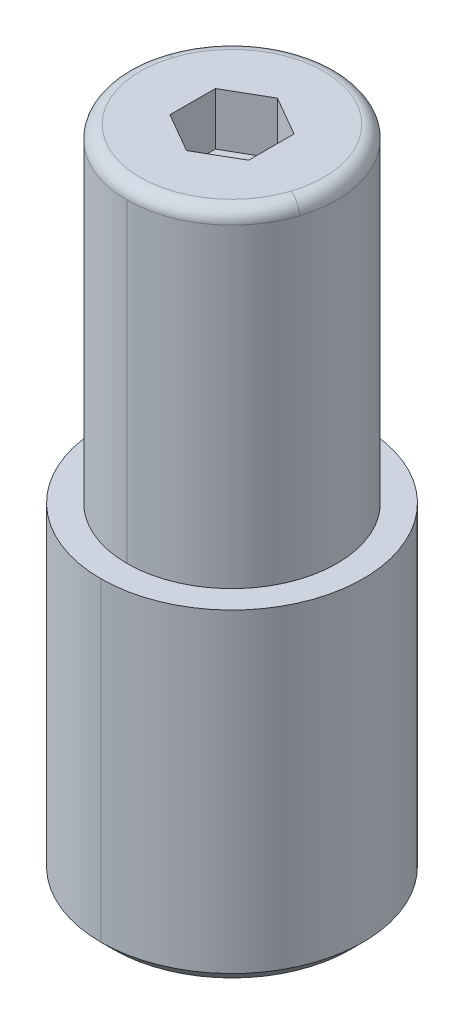
ISO-10303-21;
HEADER;
FILE_DESCRIPTION(('STEP AP214'),'2;1');
FILE_NAME('part.step','',(''),(''),'','','');
FILE_SCHEMA(('AUTOMOTIVE_DESIGN { 1 0 10303 214 1 1 1 1 }'));
ENDSEC;
DATA;
#1=APPLICATION_CONTEXT('core data for automotive mechanical design processes');
#2=APPLICATION_PROTOCOL_DEFINITION('international standard','automotive_design',2000,#1);
#3=PRODUCT_CONTEXT('',#1,'mechanical');
#4=PRODUCT('Part','Part','',(#3));
#5=PRODUCT_RELATED_PRODUCT_CATEGORY('part','',(#4));
#6=PRODUCT_DEFINITION_FORMATION('','',#4);
#7=PRODUCT_DEFINITION_CONTEXT('part definition',#1,'design');
#8=PRODUCT_DEFINITION('design','',#6,#7);
#9=PRODUCT_DEFINITION_SHAPE('','',#8);
#10=(LENGTH_UNIT() NAMED_UNIT(*) SI_UNIT(.MILLI.,.METRE.));
#11=(NAMED_UNIT(*) PLANE_ANGLE_UNIT() SI_UNIT($,.RADIAN.));
#12=(NAMED_UNIT(*) SI_UNIT($,.STERADIAN.) SOLID_ANGLE_UNIT());
#13=UNCERTAINTY_MEASURE_WITH_UNIT(LENGTH_MEASURE(1.E-05),#10,'distance_accuracy_value','');
#14=(GEOMETRIC_REPRESENTATION_CONTEXT(3) GLOBAL_UNCERTAINTY_ASSIGNED_CONTEXT((#13)) GLOBAL_UNIT_ASSIGNED_CONTEXT((#10,
#11,#12)) REPRESENTATION_CONTEXT('',''));
#15=CARTESIAN_POINT('',(0.,0.,0.));
#16=DIRECTION('',(0.,0.,1.));
#17=DIRECTION('',(1.,0.,0.));
#18=AXIS2_PLACEMENT_3D('',#15,#16,#17);
#19=CARTESIAN_POINT('',(0.,25.,0.));
#20=DIRECTION('',(0.,-1.,0.));
#21=DIRECTION('',(0.,0.,-1.));
#22=AXIS2_PLACEMENT_3D('',#19,#20,#21);
#23=PLANE('',#22);
#24=CARTESIAN_POINT('',(3.32869780703263,25.,1.08155948031218));
#25=CARTESIAN_POINT('',(3.31100196890181,25.,1.13602560121398));
#26=CARTESIAN_POINT('',(3.29196710397147,25.,1.19005653724678));
#27=CARTESIAN_POINT('',(3.25127016882578,25.,1.29711977171583));
#28=CARTESIAN_POINT('',(3.22960809861043,25.,1.35015207015209));
#29=CARTESIAN_POINT('',(3.18370760120874,25.,1.45508976156955));
#30=CARTESIAN_POINT('',(3.1594691740224,25.,1.50699515455075));
#31=CARTESIAN_POINT('',(3.10847471355772,25.,1.60955412664714));
#32=CARTESIAN_POINT('',(3.08171868027937,25.,1.66020770576233));
#33=CARTESIAN_POINT('',(3.02575336922947,25.,1.76014098471593));
#34=CARTESIAN_POINT('',(2.9965440914579,25.,1.80942068455435));
#35=CARTESIAN_POINT('',(2.93574268486102,25.,1.90648749562176));
#36=CARTESIAN_POINT('',(2.90415055603569,25.,1.95427460685077));
#37=CARTESIAN_POINT('',(2.8386595486422,25.,2.04824111474203));
#38=CARTESIAN_POINT('',(2.80476067007404,25.,2.09442051140429));
#39=CARTESIAN_POINT('',(2.73473783040991,25.,2.1850603406529));
#40=CARTESIAN_POINT('',(2.69861386931396,25.,2.22952077323924));
#41=CARTESIAN_POINT('',(2.62422788988561,25.,2.31661556507148));
#42=CARTESIAN_POINT('',(2.58596587155323,25.,2.35924992431738));
#43=CARTESIAN_POINT('',(2.50739595433818,25.,2.44258985961338));
#44=CARTESIAN_POINT('',(2.46708805545552,25.,2.48329543566349));
#45=CARTESIAN_POINT('',(2.38452348236335,25.,2.56267974125632));
#46=CARTESIAN_POINT('',(2.34226680815383,25.,2.60135847079904));
#47=CARTESIAN_POINT('',(2.2559064844469,25.,2.6765959029334));
#48=CARTESIAN_POINT('',(2.21180283494948,25.,2.71315460552503));
#49=CARTESIAN_POINT('',(2.12185481021884,25.,2.78406391063952));
#50=CARTESIAN_POINT('',(2.07601043498562,25.,2.81841451316238));
#51=CARTESIAN_POINT('',(1.98269140189949,25.,2.88482486452935));
#52=CARTESIAN_POINT('',(1.93521674404659,25.,2.91688461337347));
#53=CARTESIAN_POINT('',(1.83875151632996,25.,2.97863602263982));
#54=CARTESIAN_POINT('',(1.78976094646625,25.,3.00832768306205));
#55=CARTESIAN_POINT('',(1.69038191730192,25.,3.06527138567402));
#56=CARTESIAN_POINT('',(1.63999345800131,25.,3.09252342786375));
#57=CARTESIAN_POINT('',(1.53794004017514,25.,3.14452224145407));
#58=CARTESIAN_POINT('',(1.48627508164959,25.,3.16926901285466));
#59=CARTESIAN_POINT('',(1.38179313078394,25.,3.21619766772684));
#60=CARTESIAN_POINT('',(1.32897613844385,25.,3.23837955119842));
#61=CARTESIAN_POINT('',(1.2223173607099,25.,3.28012499211241));
#62=CARTESIAN_POINT('',(1.16847557531604,25.,3.2996885495548));
#63=CARTESIAN_POINT('',(1.05989692105155,25.,3.33615020808696));
#64=CARTESIAN_POINT('',(1.00516005218092,25.,3.35304830917672));
#65=CARTESIAN_POINT('',(0.894923096874379,25.,3.38413834599799));
#66=CARTESIAN_POINT('',(0.839423010438471,25.,3.39833028172949));
#67=CARTESIAN_POINT('',(0.727793324570835,25.,3.42397379821799));
#68=CARTESIAN_POINT('',(0.671663725139107,25.,3.43542537897499));
#69=CARTESIAN_POINT('',(0.558910234401233,25.,3.45556059765341));
#70=CARTESIAN_POINT('',(0.502286343095088,25.,3.46424423557482));
#71=CARTESIAN_POINT('',(0.388680680522205,25.,3.47882264893771));
#72=CARTESIAN_POINT('',(0.331698909255467,25.,3.48471742437919));
#73=CARTESIAN_POINT('',(0.217514760839391,25.,3.49370391175185));
#74=CARTESIAN_POINT('',(0.160312383690054,25.,3.49679562368304));
#75=CARTESIAN_POINT('',(0.0458248290456724,25.,3.50016853583026));
#76=CARTESIAN_POINT('',(-0.0114603484493725,25.,3.5004497360463));
#77=CARTESIAN_POINT('',(-0.125975498774997,25.,3.4982009473273));
#78=CARTESIAN_POINT('',(-0.183205471605577,25.,3.49567095839225));
#79=CARTESIAN_POINT('',(-0.297472340584969,25.,3.48780588633601));
#80=CARTESIAN_POINT('',(-0.35450923673378,25.,3.48247080321482));
#81=CARTESIAN_POINT('',(-0.468252545470971,25.,3.46900839546882));
#82=CARTESIAN_POINT('',(-0.524958958059351,25.,3.46088107084402));
#83=CARTESIAN_POINT('',(-0.637904688960856,25.,3.4418537595277));
#84=CARTESIAN_POINT('',(-0.694144007273981,25.,3.43095377283618));
#85=CARTESIAN_POINT('',(-0.80602006418118,25.,3.40640739640909));
#86=CARTESIAN_POINT('',(-0.861656802775253,25.,3.39276100667352));
#87=CARTESIAN_POINT('',(-0.972193666467872,25.,3.36275469950649));
#88=CARTESIAN_POINT('',(-1.02709379156642,25.,3.34639478207502));
#89=CARTESIAN_POINT('',(-1.13602516905794,25.,3.31100083199025));
#90=CARTESIAN_POINT('',(-1.19005642145091,25.,3.29196679933694));
#91=CARTESIAN_POINT('',(-1.29711988751169,25.,3.25127047346032));
#92=CARTESIAN_POINT('',(-1.35015210117949,25.,3.22960818023701));
#93=CARTESIAN_POINT('',(-1.45508973054214,25.,3.18370751958216));
#94=CARTESIAN_POINT('',(-1.50699514623698,25.,3.15946915215063));
#95=CARTESIAN_POINT('',(-1.60955413496091,25.,3.1084747354295));
#96=CARTESIAN_POINT('',(-1.66020770798999,25.,3.0817186861399));
#97=CARTESIAN_POINT('',(-1.76014098248826,25.,3.02575336336894));
#98=CARTESIAN_POINT('',(-1.80942068395744,25.,2.99654408988758));
#99=CARTESIAN_POINT('',(-1.90648749621866,25.,2.93574268643134));
#100=CARTESIAN_POINT('',(-1.9542746070107,25.,2.90415055645646));
#101=CARTESIAN_POINT('',(-2.04824111458209,25.,2.83865954822144));
#102=CARTESIAN_POINT('',(-2.09442051136143,25.,2.8047606699613));
#103=CARTESIAN_POINT('',(-2.18506034069575,25.,2.73473783052266));
#104=CARTESIAN_POINT('',(-2.22952077325072,25.,2.69861386934417));
#105=CARTESIAN_POINT('',(-2.31661556506,25.,2.62422788985541));
#106=CARTESIAN_POINT('',(-2.3592499243143,25.,2.58596587154514));
#107=CARTESIAN_POINT('',(-2.44258985961645,25.,2.50739595434628));
#108=CARTESIAN_POINT('',(-2.48329543566431,25.,2.46708805545769));
#109=CARTESIAN_POINT('',(-2.56267974125549,25.,2.38452348236118));
#110=CARTESIAN_POINT('',(-2.60135847079882,25.,2.34226680815326));
#111=CARTESIAN_POINT('',(-2.67659590293361,25.,2.25590648444749));
#112=CARTESIAN_POINT('',(-2.71315460552508,25.,2.21180283494964));
#113=CARTESIAN_POINT('',(-2.78406391063945,25.,2.12185481021869));
#114=CARTESIAN_POINT('',(-2.81841451316236,25.,2.07601043498558));
#115=CARTESIAN_POINT('',(-2.88482486452936,25.,1.98269140189954));
#116=CARTESIAN_POINT('',(-2.91688461337347,25.,1.9352167440466));
#117=CARTESIAN_POINT('',(-2.97863602263981,25.,1.83875151632996));
#118=CARTESIAN_POINT('',(-3.00832768306204,25.,1.78976094646625));
#119=CARTESIAN_POINT('',(-3.06527138567401,25.,1.69038191730193));
#120=CARTESIAN_POINT('',(-3.09252342786374,25.,1.63999345800131));
#121=CARTESIAN_POINT('',(-3.14452224145406,25.,1.53794004017515));
#122=CARTESIAN_POINT('',(-3.16926901285465,25.,1.48627508164959));
#123=CARTESIAN_POINT('',(-3.21619766772684,25.,1.38179313078394));
#124=CARTESIAN_POINT('',(-3.23837955119843,25.,1.32897613844385));
#125=CARTESIAN_POINT('',(-3.28012499211239,25.,1.2223173607099));
#126=CARTESIAN_POINT('',(-3.29968854955476,25.,1.16847557531605));
#127=CARTESIAN_POINT('',(-3.336150208087,25.,1.05989692105154));
#128=CARTESIAN_POINT('',(-3.35304830917688,25.,1.00516005218088));
#129=CARTESIAN_POINT('',(-3.38413834599782,25.,0.894923096874429));
#130=CARTESIAN_POINT('',(-3.39833028172889,25.,0.839423010438641));
#131=CARTESIAN_POINT('',(-3.42397379821859,25.,0.72779332457068));
#132=CARTESIAN_POINT('',(-3.43542537897723,25.,0.671663725138506));
#133=CARTESIAN_POINT('',(-3.45556059765117,25.,0.558910234401848));
#134=CARTESIAN_POINT('',(-3.46424423556646,25.,0.502286343097365));
#135=CARTESIAN_POINT('',(-3.47882264894607,25.,0.388680680519945));
#136=CARTESIAN_POINT('',(-3.48471742441038,25.,0.331698909247007));
#137=CARTESIAN_POINT('',(-3.49370391172066,25.,0.217514760847865));
#138=CARTESIAN_POINT('',(-3.49679562356663,25.,0.16031238372166));
#139=CARTESIAN_POINT('',(-3.50016853594666,25.,0.0458248290140814));
#140=CARTESIAN_POINT('',(-3.50044973648072,25.,-0.0114603485672923));
#141=CARTESIAN_POINT('',(-3.49820094689288,25.,-0.125975498657063));
#142=CARTESIAN_POINT('',(-3.49567095677098,25.,-0.183205471165461));
#143=CARTESIAN_POINT('',(-3.48780588795728,25.,-0.29747234102507));
#144=CARTESIAN_POINT('',(-3.48247080926547,25.,-0.354509238376281));
#145=CARTESIAN_POINT('',(-3.46900838941817,25.,-0.468252543828454));
#146=CARTESIAN_POINT('',(-3.46088104826267,25.,-0.524958951929415));
#147=CARTESIAN_POINT('',(-3.44185378210905,25.,-0.637904695090773));
#148=CARTESIAN_POINT('',(-3.43095385711093,25.,-0.69414403015117));
#149=CARTESIAN_POINT('',(-3.40640731213435,25.,-0.806020041303973));
#150=CARTESIAN_POINT('',(-3.39276069215591,25.,-0.861656717396378));
#151=CARTESIAN_POINT('',(-3.36275501402411,25.,-0.972193751846732));
#152=CARTESIAN_POINT('',(-3.34639595587075,25.,-1.02709411020468));
#153=CARTESIAN_POINT('',(-3.32869780703264,25.,-1.08155948031217));
#154=B_SPLINE_CURVE_WITH_KNOTS('',3,(#24,#25,#26,#27,#28,#29,#30,#31,#32,#33,#34,#35,#36,#37,
#38,#39,#40,#41,#42,#43,#44,#45,#46,#47,#48,#49,#50,#51,#52,#53,#54,#55,#56,#57,#58,#59,#60,#61,
#62,#63,#64,#65,#66,#67,#68,#69,#70,#71,#72,#73,#74,#75,#76,#77,#78,#79,#80,#81,#82,#83,#84,#85,
#86,#87,#88,#89,#90,#91,#92,#93,#94,#95,#96,#97,#98,#99,#100,#101,#102,#103,#104,#105,#106,#107,
#108,#109,#110,#111,#112,#113,#114,#115,#116,#117,#118,#119,#120,#121,#122,#123,#124,#125,#126,
#127,#128,#129,#130,#131,#132,#133,#134,#135,#136,#137,#138,#139,#140,#141,#142,#143,#144,#145,
#146,#147,#148,#149,#150,#151,#152,#153),.UNSPECIFIED.,.F.,.F.,(4,2,2,2,2,2,2,2,2,2,2,2,2,2,2,2,
2,2,2,2,2,2,2,2,2,2,2,2,2,2,2,2,2,2,2,2,2,2,2,2,2,2,2,2,2,2,2,2,2,2,2,2,2,2,2,2,2,2,2,2,2,2,2,2,
4),(0.,0.171788599660365,0.34357719932073,0.515365798981095,0.68715439864146,0.858942998301824,
1.03073159796219,1.20252019762255,1.37430879728292,1.54609739694329,1.71788599660365,
1.88967459626401,2.06146319592438,2.23325179558474,2.40504039524511,2.57682899490547,
2.74861759456584,2.9204061942262,3.09219479388657,3.26398339354694,3.4357719932073,
3.60756059286766,3.77934919252803,3.95113779218839,4.12292639184876,4.29471499150913,
4.46650359116949,4.63829219082985,4.81008079049022,4.98186939015059,5.15365798981095,
5.32544658947131,5.49723518913168,5.66902378879204,5.84081238845241,6.01260098811277,
6.18438958777314,6.3561781874335,6.52796678709387,6.69975538675423,6.8715439864146,
7.04333258607496,7.21512118573533,7.38690978539569,7.55869838505606,7.73048698471642,
7.90227558437678,8.07406418403715,8.24585278369752,8.41764138335788,8.58942998301825,
8.76121858267861,8.93300718233898,9.10479578199934,9.2765843816597,9.44837298132007,
9.62016158098043,9.7919501806408,9.96373878030116,10.1355273799615,10.3073159796219,
10.4791045792823,10.6508931789426,10.822681778603,10.9944703782633),.UNSPECIFIED.);
#155=CARTESIAN_POINT('',(3.32869780703263,25.,1.08155948031218));
#156=VERTEX_POINT('',#155);
#157=CARTESIAN_POINT('',(-3.32869780703263,25.,-1.08155948031218));
#158=VERTEX_POINT('',#157);
#159=EDGE_CURVE('E10',#156,#158,#154,.T.);
#160=ORIENTED_EDGE('',*,*,#159,.F.);
#161=CARTESIAN_POINT('',(-3.32869780703263,25.,-1.08155948031218));
#162=CARTESIAN_POINT('',(-3.31100196890181,25.,-1.13602560121398));
#163=CARTESIAN_POINT('',(-3.29196710397147,25.,-1.19005653724678));
#164=CARTESIAN_POINT('',(-3.25127016882578,25.,-1.29711977171583));
#165=CARTESIAN_POINT('',(-3.22960809861043,25.,-1.35015207015209));
#166=CARTESIAN_POINT('',(-3.18370760120874,25.,-1.45508976156955));
#167=CARTESIAN_POINT('',(-3.1594691740224,25.,-1.50699515455075));
#168=CARTESIAN_POINT('',(-3.10847471355772,25.,-1.60955412664714));
#169=CARTESIAN_POINT('',(-3.08171868027937,25.,-1.66020770576233));
#170=CARTESIAN_POINT('',(-3.02575336922947,25.,-1.76014098471593));
#171=CARTESIAN_POINT('',(-2.9965440914579,25.,-1.80942068455435));
#172=CARTESIAN_POINT('',(-2.93574268486102,25.,-1.90648749562176));
#173=CARTESIAN_POINT('',(-2.90415055603569,25.,-1.95427460685077));
#174=CARTESIAN_POINT('',(-2.8386595486422,25.,-2.04824111474203));
#175=CARTESIAN_POINT('',(-2.80476067007404,25.,-2.09442051140429));
#176=CARTESIAN_POINT('',(-2.73473783040991,25.,-2.1850603406529));
#177=CARTESIAN_POINT('',(-2.69861386931396,25.,-2.22952077323924));
#178=CARTESIAN_POINT('',(-2.62422788988562,25.,-2.31661556507148));
#179=CARTESIAN_POINT('',(-2.58596587155323,25.,-2.35924992431738));
#180=CARTESIAN_POINT('',(-2.50739595433818,25.,-2.44258985961338));
#181=CARTESIAN_POINT('',(-2.46708805545552,25.,-2.48329543566349));
#182=CARTESIAN_POINT('',(-2.38452348236335,25.,-2.56267974125632));
#183=CARTESIAN_POINT('',(-2.34226680815383,25.,-2.60135847079904));
#184=CARTESIAN_POINT('',(-2.2559064844469,25.,-2.6765959029334));
#185=CARTESIAN_POINT('',(-2.21180283494948,25.,-2.71315460552502));
#186=CARTESIAN_POINT('',(-2.12185481021884,25.,-2.78406391063951));
#187=CARTESIAN_POINT('',(-2.07601043498562,25.,-2.81841451316238));
#188=CARTESIAN_POINT('',(-1.98269140189949,25.,-2.88482486452935));
#189=CARTESIAN_POINT('',(-1.93521674404659,25.,-2.91688461337347));
#190=CARTESIAN_POINT('',(-1.83875151632996,25.,-2.97863602263982));
#191=CARTESIAN_POINT('',(-1.78976094646625,25.,-3.00832768306205));
#192=CARTESIAN_POINT('',(-1.69038191730192,25.,-3.06527138567401));
#193=CARTESIAN_POINT('',(-1.63999345800131,25.,-3.09252342786374));
#194=CARTESIAN_POINT('',(-1.53794004017514,25.,-3.14452224145407));
#195=CARTESIAN_POINT('',(-1.48627508164959,25.,-3.16926901285466));
#196=CARTESIAN_POINT('',(-1.38179313078394,25.,-3.21619766772683));
#197=CARTESIAN_POINT('',(-1.32897613844385,25.,-3.23837955119842));
#198=CARTESIAN_POINT('',(-1.2223173607099,25.,-3.28012499211241));
#199=CARTESIAN_POINT('',(-1.16847557531604,25.,-3.2996885495548));
#200=CARTESIAN_POINT('',(-1.05989692105155,25.,-3.33615020808696));
#201=CARTESIAN_POINT('',(-1.00516005218092,25.,-3.35304830917672));
#202=CARTESIAN_POINT('',(-0.894923096874382,25.,-3.38413834599799));
#203=CARTESIAN_POINT('',(-0.839423010438474,25.,-3.39833028172949));
#204=CARTESIAN_POINT('',(-0.727793324570838,25.,-3.42397379821799));
#205=CARTESIAN_POINT('',(-0.67166372513911,25.,-3.43542537897499));
#206=CARTESIAN_POINT('',(-0.558910234401237,25.,-3.45556059765341));
#207=CARTESIAN_POINT('',(-0.502286343095092,25.,-3.46424423557482));
#208=CARTESIAN_POINT('',(-0.388680680522208,25.,-3.47882264893771));
#209=CARTESIAN_POINT('',(-0.33169890925547,25.,-3.48471742437919));
#210=CARTESIAN_POINT('',(-0.217514760839395,25.,-3.49370391175185));
#211=CARTESIAN_POINT('',(-0.160312383690058,25.,-3.49679562368304));
#212=CARTESIAN_POINT('',(-0.0458248290456753,25.,-3.50016853583026));
#213=CARTESIAN_POINT('',(0.01146034844937,25.,-3.5004497360463));
#214=CARTESIAN_POINT('',(0.125975498774995,25.,-3.4982009473273));
#215=CARTESIAN_POINT('',(0.183205471605575,25.,-3.49567095839225));
#216=CARTESIAN_POINT('',(0.297472340584966,25.,-3.48780588633601));
#217=CARTESIAN_POINT('',(0.354509236733777,25.,-3.48247080321482));
#218=CARTESIAN_POINT('',(0.468252545470967,25.,-3.46900839546882));
#219=CARTESIAN_POINT('',(0.524958958059345,25.,-3.46088107084402));
#220=CARTESIAN_POINT('',(0.63790468896085,25.,-3.4418537595277));
#221=CARTESIAN_POINT('',(0.694144007273977,25.,-3.43095377283618));
#222=CARTESIAN_POINT('',(0.806020064181177,25.,-3.40640739640909));
#223=CARTESIAN_POINT('',(0.86165680277525,25.,-3.39276100667352));
#224=CARTESIAN_POINT('',(0.97219366646787,25.,-3.36275469950649));
#225=CARTESIAN_POINT('',(1.02709379156642,25.,-3.34639478207502));
#226=CARTESIAN_POINT('',(1.13602516905793,25.,-3.31100083199025));
#227=CARTESIAN_POINT('',(1.19005642145091,25.,-3.29196679933694));
#228=CARTESIAN_POINT('',(1.29711988751168,25.,-3.25127047346032));
#229=CARTESIAN_POINT('',(1.35015210117949,25.,-3.22960818023701));
#230=CARTESIAN_POINT('',(1.45508973054214,25.,-3.18370751958217));
#231=CARTESIAN_POINT('',(1.50699514623698,25.,-3.15946915215063));
#232=CARTESIAN_POINT('',(1.6095541349609,25.,-3.1084747354295));
#233=CARTESIAN_POINT('',(1.66020770798999,25.,-3.0817186861399));
#234=CARTESIAN_POINT('',(1.76014098248826,25.,-3.02575336336895));
#235=CARTESIAN_POINT('',(1.80942068395744,25.,-2.99654408988759));
#236=CARTESIAN_POINT('',(1.90648749621866,25.,-2.93574268643135));
#237=CARTESIAN_POINT('',(1.9542746070107,25.,-2.90415055645647));
#238=CARTESIAN_POINT('',(2.04824111458208,25.,-2.83865954822144));
#239=CARTESIAN_POINT('',(2.09442051136143,25.,-2.8047606699613));
#240=CARTESIAN_POINT('',(2.18506034069575,25.,-2.73473783052266));
#241=CARTESIAN_POINT('',(2.22952077325072,25.,-2.69861386934417));
#242=CARTESIAN_POINT('',(2.31661556505999,25.,-2.62422788985541));
#243=CARTESIAN_POINT('',(2.35924992431429,25.,-2.58596587154514));
#244=CARTESIAN_POINT('',(2.44258985961645,25.,-2.50739595434628));
#245=CARTESIAN_POINT('',(2.48329543566431,25.,-2.46708805545769));
#246=CARTESIAN_POINT('',(2.56267974125549,25.,-2.38452348236118));
#247=CARTESIAN_POINT('',(2.60135847079882,25.,-2.34226680815326));
#248=CARTESIAN_POINT('',(2.67659590293361,25.,-2.25590648444749));
#249=CARTESIAN_POINT('',(2.71315460552508,25.,-2.21180283494964));
#250=CARTESIAN_POINT('',(2.78406391063945,25.,-2.12185481021869));
#251=CARTESIAN_POINT('',(2.81841451316235,25.,-2.07601043498558));
#252=CARTESIAN_POINT('',(2.88482486452936,25.,-1.98269140189954));
#253=CARTESIAN_POINT('',(2.91688461337346,25.,-1.93521674404661));
#254=CARTESIAN_POINT('',(2.97863602263981,25.,-1.83875151632996));
#255=CARTESIAN_POINT('',(3.00832768306204,25.,-1.78976094646625));
#256=CARTESIAN_POINT('',(3.06527138567401,25.,-1.69038191730193));
#257=CARTESIAN_POINT('',(3.09252342786374,25.,-1.63999345800132));
#258=CARTESIAN_POINT('',(3.14452224145406,25.,-1.53794004017515));
#259=CARTESIAN_POINT('',(3.16926901285465,25.,-1.4862750816496));
#260=CARTESIAN_POINT('',(3.21619766772683,25.,-1.38179313078395));
#261=CARTESIAN_POINT('',(3.23837955119843,25.,-1.32897613844385));
#262=CARTESIAN_POINT('',(3.28012499211239,25.,-1.22231736070991));
#263=CARTESIAN_POINT('',(3.29968854955475,25.,-1.16847557531606));
#264=CARTESIAN_POINT('',(3.336150208087,25.,-1.05989692105155));
#265=CARTESIAN_POINT('',(3.35304830917688,25.,-1.00516005218088));
#266=CARTESIAN_POINT('',(3.38413834599782,25.,-0.894923096874434));
#267=CARTESIAN_POINT('',(3.39833028172889,25.,-0.839423010438646));
#268=CARTESIAN_POINT('',(3.42397379821859,25.,-0.727793324570684));
#269=CARTESIAN_POINT('',(3.43542537897723,25.,-0.671663725138511));
#270=CARTESIAN_POINT('',(3.45556059765117,25.,-0.558910234401854));
#271=CARTESIAN_POINT('',(3.46424423556646,25.,-0.50228634309737));
#272=CARTESIAN_POINT('',(3.47882264894607,25.,-0.388680680519949));
#273=CARTESIAN_POINT('',(3.48471742441038,25.,-0.331698909247013));
#274=CARTESIAN_POINT('',(3.49370391172066,25.,-0.217514760847871));
#275=CARTESIAN_POINT('',(3.49679562356663,25.,-0.160312383721667));
#276=CARTESIAN_POINT('',(3.50016853594666,25.,-0.0458248290140881));
#277=CARTESIAN_POINT('',(3.50044973648072,25.,0.0114603485672856));
#278=CARTESIAN_POINT('',(3.49820094689288,25.,0.125975498657057));
#279=CARTESIAN_POINT('',(3.49567095677098,25.,0.183205471165454));
#280=CARTESIAN_POINT('',(3.48780588795728,25.,0.297472341025063));
#281=CARTESIAN_POINT('',(3.48247080926547,25.,0.354509238376275));
#282=CARTESIAN_POINT('',(3.46900838941817,25.,0.468252543828448));
#283=CARTESIAN_POINT('',(3.46088104826267,25.,0.52495895192941));
#284=CARTESIAN_POINT('',(3.44185378210905,25.,0.637904695090769));
#285=CARTESIAN_POINT('',(3.43095385711093,25.,0.694144030151167));
#286=CARTESIAN_POINT('',(3.40640731213435,25.,0.806020041303969));
#287=CARTESIAN_POINT('',(3.39276069215591,25.,0.861656717396374));
#288=CARTESIAN_POINT('',(3.36275501402411,25.,0.972193751846728));
#289=CARTESIAN_POINT('',(3.34639595587075,25.,1.02709411020468));
#290=CARTESIAN_POINT('',(3.32869780703264,25.,1.08155948031217));
#291=B_SPLINE_CURVE_WITH_KNOTS('',3,(#161,#162,#163,#164,#165,#166,#167,#168,#169,#170,#171,
#172,#173,#174,#175,#176,#177,#178,#179,#180,#181,#182,#183,#184,#185,#186,#187,#188,#189,#190,
#191,#192,#193,#194,#195,#196,#197,#198,#199,#200,#201,#202,#203,#204,#205,#206,#207,#208,#209,
#210,#211,#212,#213,#214,#215,#216,#217,#218,#219,#220,#221,#222,#223,#224,#225,#226,#227,#228,
#229,#230,#231,#232,#233,#234,#235,#236,#237,#238,#239,#240,#241,#242,#243,#244,#245,#246,#247,
#248,#249,#250,#251,#252,#253,#254,#255,#256,#257,#258,#259,#260,#261,#262,#263,#264,#265,#266,
#267,#268,#269,#270,#271,#272,#273,#274,#275,#276,#277,#278,#279,#280,#281,#282,#283,#284,#285,
#286,#287,#288,#289,#290),.UNSPECIFIED.,.F.,.F.,(4,2,2,2,2,2,2,2,2,2,2,2,2,2,2,2,2,2,2,2,2,2,2,
2,2,2,2,2,2,2,2,2,2,2,2,2,2,2,2,2,2,2,2,2,2,2,2,2,2,2,2,2,2,2,2,2,2,2,2,2,2,2,2,2,4),(0.,
0.171788599660365,0.343577199320729,0.515365798981094,0.687154398641459,0.858942998301825,
1.03073159796219,1.20252019762255,1.37430879728292,1.54609739694328,1.71788599660365,
1.88967459626401,2.06146319592438,2.23325179558474,2.40504039524511,2.57682899490547,
2.74861759456584,2.9204061942262,3.09219479388657,3.26398339354693,3.4357719932073,
3.60756059286766,3.77934919252803,3.95113779218839,4.12292639184875,4.29471499150912,
4.46650359116949,4.63829219082985,4.81008079049021,4.98186939015058,5.15365798981095,
5.32544658947131,5.49723518913167,5.66902378879204,5.8408123884524,6.01260098811277,
6.18438958777313,6.3561781874335,6.52796678709386,6.69975538675423,6.87154398641459,
7.04333258607496,7.21512118573532,7.38690978539569,7.55869838505605,7.73048698471641,
7.90227558437678,8.07406418403714,8.24585278369751,8.41764138335787,8.58942998301824,
8.7612185826786,8.93300718233897,9.10479578199933,9.27658438165969,9.44837298132006,
9.62016158098042,9.79195018064078,9.96373878030115,10.1355273799615,10.3073159796219,
10.4791045792822,10.6508931789426,10.822681778603,10.9944703782633),.UNSPECIFIED.);
#292=EDGE_CURVE('E25',#158,#156,#291,.T.);
#293=ORIENTED_EDGE('',*,*,#292,.F.);
#294=EDGE_LOOP('',(#160,#293));
#295=FACE_BOUND('',#294,.T.);
#296=DIRECTION('',(0.866025403784433,0.,-0.500000000000009));
#297=VECTOR('',#296,1.);
#298=CARTESIAN_POINT('',(0.,25.,1.7320508075689));
#299=LINE('',#298,#297);
#300=CARTESIAN_POINT('',(0.,25.,1.7320508075689));
#301=VERTEX_POINT('',#300);
#302=CARTESIAN_POINT('',(1.5,25.,0.86602540378444));
#303=VERTEX_POINT('',#302);
#304=EDGE_CURVE('E363',#301,#303,#299,.T.);
#305=ORIENTED_EDGE('',*,*,#304,.F.);
#306=DIRECTION('',(0.866025403784433,0.,0.500000000000009));
#307=VECTOR('',#306,1.);
#308=CARTESIAN_POINT('',(-1.5,25.,0.86602540378444));
#309=LINE('',#308,#307);
#310=CARTESIAN_POINT('',(-1.5,25.,0.86602540378444));
#311=VERTEX_POINT('',#310);
#312=EDGE_CURVE('E358',#311,#301,#309,.T.);
#313=ORIENTED_EDGE('',*,*,#312,.F.);
#314=DIRECTION('',(0.,0.,1.));
#315=VECTOR('',#314,1.);
#316=CARTESIAN_POINT('',(-1.5,25.,-0.86602540378444));
#317=LINE('',#316,#315);
#318=CARTESIAN_POINT('',(-1.5,25.,-0.86602540378444));
#319=VERTEX_POINT('',#318);
#320=EDGE_CURVE('E353',#319,#311,#317,.T.);
#321=ORIENTED_EDGE('',*,*,#320,.F.);
#322=DIRECTION('',(-0.866025403784433,0.,0.500000000000009));
#323=VECTOR('',#322,1.);
#324=CARTESIAN_POINT('',(0.,25.,-1.7320508075689));
#325=LINE('',#324,#323);
#326=CARTESIAN_POINT('',(0.,25.,-1.7320508075689));
#327=VERTEX_POINT('',#326);
#328=EDGE_CURVE('E348',#327,#319,#325,.T.);
#329=ORIENTED_EDGE('',*,*,#328,.F.);
#330=DIRECTION('',(-0.866025403784433,0.,-0.500000000000009));
#331=VECTOR('',#330,1.);
#332=CARTESIAN_POINT('',(1.5,25.,-0.86602540378444));
#333=LINE('',#332,#331);
#334=CARTESIAN_POINT('',(1.5,25.,-0.86602540378444));
#335=VERTEX_POINT('',#334);
#336=EDGE_CURVE('E343',#335,#327,#333,.T.);
#337=ORIENTED_EDGE('',*,*,#336,.F.);
#338=DIRECTION('',(0.,0.,1.));
#339=VECTOR('',#338,1.);
#340=CARTESIAN_POINT('',(1.5,25.,0.));
#341=LINE('',#340,#339);
#342=EDGE_CURVE('E339',#335,#303,#341,.T.);
#343=ORIENTED_EDGE('',*,*,#342,.T.);
#344=EDGE_LOOP('',(#305,#313,#321,#329,#337,#343));
#345=FACE_BOUND('',#344,.T.);
#346=ADVANCED_FACE('F16',(#295,#345),#23,.F.);
#347=CARTESIAN_POINT('',(1.5,23.,0.86602540378444));
#348=DIRECTION('',(1.,0.,0.));
#349=DIRECTION('',(0.,0.,-1.));
#350=AXIS2_PLACEMENT_3D('',#347,#348,#349);
#351=PLANE('',#350);
#352=DIRECTION('',(0.,1.,0.));
#353=VECTOR('',#352,1.);
#354=CARTESIAN_POINT('',(1.5,23.,0.86602540378444));
#355=LINE('',#354,#353);
#356=CARTESIAN_POINT('',(1.5,23.,0.86602540378444));
#357=VERTEX_POINT('',#356);
#358=EDGE_CURVE('E334',#357,#303,#355,.T.);
#359=ORIENTED_EDGE('',*,*,#358,.T.);
#360=ORIENTED_EDGE('',*,*,#342,.F.);
#361=DIRECTION('',(0.,1.,0.));
#362=VECTOR('',#361,1.);
#363=CARTESIAN_POINT('',(1.5,23.,-0.86602540378444));
#364=LINE('',#363,#362);
#365=CARTESIAN_POINT('',(1.5,23.,-0.86602540378444));
#366=VERTEX_POINT('',#365);
#367=EDGE_CURVE('E329',#366,#335,#364,.T.);
#368=ORIENTED_EDGE('',*,*,#367,.F.);
#369=DIRECTION('',(0.,0.,-1.));
#370=VECTOR('',#369,1.);
#371=CARTESIAN_POINT('',(1.5,23.,0.86602540378444));
#372=LINE('',#371,#370);
#373=EDGE_CURVE('E324',#357,#366,#372,.T.);
#374=ORIENTED_EDGE('',*,*,#373,.F.);
#375=EDGE_LOOP('',(#359,#360,#368,#374));
#376=FACE_BOUND('',#375,.T.);
#377=ADVANCED_FACE('F391',(#376),#351,.F.);
#378=CARTESIAN_POINT('',(0.,23.,0.));
#379=DIRECTION('',(0.,1.,0.));
#380=DIRECTION('',(0.,0.,1.));
#381=AXIS2_PLACEMENT_3D('',#378,#379,#380);
#382=PLANE('',#381);
#383=DIRECTION('',(0.,0.,1.));
#384=VECTOR('',#383,1.);
#385=CARTESIAN_POINT('',(-1.5,23.,-0.86602540378444));
#386=LINE('',#385,#384);
#387=CARTESIAN_POINT('',(-1.5,23.,-0.86602540378444));
#388=VERTEX_POINT('',#387);
#389=CARTESIAN_POINT('',(-1.5,23.,0.86602540378444));
#390=VERTEX_POINT('',#389);
#391=EDGE_CURVE('E320',#388,#390,#386,.T.);
#392=ORIENTED_EDGE('',*,*,#391,.T.);
#393=DIRECTION('',(0.866025403784433,0.,0.500000000000009));
#394=VECTOR('',#393,1.);
#395=CARTESIAN_POINT('',(-1.5,23.,0.86602540378444));
#396=LINE('',#395,#394);
#397=CARTESIAN_POINT('',(0.,23.,1.7320508075689));
#398=VERTEX_POINT('',#397);
#399=EDGE_CURVE('E316',#390,#398,#396,.T.);
#400=ORIENTED_EDGE('',*,*,#399,.T.);
#401=DIRECTION('',(0.866025403784433,0.,-0.500000000000009));
#402=VECTOR('',#401,1.);
#403=CARTESIAN_POINT('',(0.,23.,1.7320508075689));
#404=LINE('',#403,#402);
#405=EDGE_CURVE('E311',#398,#357,#404,.T.);
#406=ORIENTED_EDGE('',*,*,#405,.T.);
#407=ORIENTED_EDGE('',*,*,#373,.T.);
#408=DIRECTION('',(-0.866025403784433,0.,-0.500000000000009));
#409=VECTOR('',#408,1.);
#410=CARTESIAN_POINT('',(1.5,23.,-0.86602540378444));
#411=LINE('',#410,#409);
#412=CARTESIAN_POINT('',(0.,23.,-1.7320508075689));
#413=VERTEX_POINT('',#412);
#414=EDGE_CURVE('E307',#366,#413,#411,.T.);
#415=ORIENTED_EDGE('',*,*,#414,.T.);
#416=DIRECTION('',(-0.866025403784433,0.,0.500000000000009));
#417=VECTOR('',#416,1.);
#418=CARTESIAN_POINT('',(0.,23.,-1.7320508075689));
#419=LINE('',#418,#417);
#420=EDGE_CURVE('E303',#413,#388,#419,.T.);
#421=ORIENTED_EDGE('',*,*,#420,.T.);
#422=EDGE_LOOP('',(#392,#400,#406,#407,#415,#421));
#423=FACE_BOUND('',#422,.T.);
#424=ADVANCED_FACE('F394',(#423),#382,.T.);
#425=CARTESIAN_POINT('',(0.,23.,-1.7320508075689));
#426=DIRECTION('',(-0.500000000000009,0.,-0.866025403784434));
#427=DIRECTION('',(-0.866025403784434,0.,0.500000000000009));
#428=AXIS2_PLACEMENT_3D('',#425,#426,#427);
#429=PLANE('',#428);
#430=ORIENTED_EDGE('',*,*,#328,.T.);
#431=DIRECTION('',(0.,1.,0.));
#432=VECTOR('',#431,1.);
#433=CARTESIAN_POINT('',(-1.5,23.,-0.86602540378444));
#434=LINE('',#433,#432);
#435=EDGE_CURVE('E298',#388,#319,#434,.T.);
#436=ORIENTED_EDGE('',*,*,#435,.F.);
#437=ORIENTED_EDGE('',*,*,#420,.F.);
#438=DIRECTION('',(0.,1.,0.));
#439=VECTOR('',#438,1.);
#440=CARTESIAN_POINT('',(0.,23.,-1.7320508075689));
#441=LINE('',#440,#439);
#442=EDGE_CURVE('E293',#413,#327,#441,.T.);
#443=ORIENTED_EDGE('',*,*,#442,.T.);
#444=EDGE_LOOP('',(#430,#436,#437,#443));
#445=FACE_BOUND('',#444,.T.);
#446=ADVANCED_FACE('F406',(#445),#429,.F.);
#447=CARTESIAN_POINT('',(1.5,23.,-0.86602540378444));
#448=DIRECTION('',(0.500000000000009,0.,-0.866025403784434));
#449=DIRECTION('',(-0.866025403784434,0.,-0.500000000000009));
#450=AXIS2_PLACEMENT_3D('',#447,#448,#449);
#451=PLANE('',#450);
#452=ORIENTED_EDGE('',*,*,#336,.T.);
#453=ORIENTED_EDGE('',*,*,#442,.F.);
#454=ORIENTED_EDGE('',*,*,#414,.F.);
#455=ORIENTED_EDGE('',*,*,#367,.T.);
#456=EDGE_LOOP('',(#452,#453,#454,#455));
#457=FACE_BOUND('',#456,.T.);
#458=ADVANCED_FACE('F408',(#457),#451,.F.);
#459=CARTESIAN_POINT('',(-1.5,23.,-0.86602540378444));
#460=DIRECTION('',(-1.,0.,0.));
#461=DIRECTION('',(0.,0.,1.));
#462=AXIS2_PLACEMENT_3D('',#459,#460,#461);
#463=PLANE('',#462);
#464=ORIENTED_EDGE('',*,*,#320,.T.);
#465=DIRECTION('',(0.,1.,0.));
#466=VECTOR('',#465,1.);
#467=CARTESIAN_POINT('',(-1.5,23.,0.86602540378444));
#468=LINE('',#467,#466);
#469=EDGE_CURVE('E288',#390,#311,#468,.T.);
#470=ORIENTED_EDGE('',*,*,#469,.F.);
#471=ORIENTED_EDGE('',*,*,#391,.F.);
#472=ORIENTED_EDGE('',*,*,#435,.T.);
#473=EDGE_LOOP('',(#464,#470,#471,#472));
#474=FACE_BOUND('',#473,.T.);
#475=ADVANCED_FACE('F401',(#474),#463,.F.);
#476=CARTESIAN_POINT('',(-1.5,23.,0.86602540378444));
#477=DIRECTION('',(-0.500000000000009,0.,0.866025403784434));
#478=DIRECTION('',(0.866025403784434,0.,0.500000000000009));
#479=AXIS2_PLACEMENT_3D('',#476,#477,#478);
#480=PLANE('',#479);
#481=ORIENTED_EDGE('',*,*,#312,.T.);
#482=DIRECTION('',(0.,1.,0.));
#483=VECTOR('',#482,1.);
#484=CARTESIAN_POINT('',(0.,23.,1.7320508075689));
#485=LINE('',#484,#483);
#486=EDGE_CURVE('E282',#398,#301,#485,.T.);
#487=ORIENTED_EDGE('',*,*,#486,.F.);
#488=ORIENTED_EDGE('',*,*,#399,.F.);
#489=ORIENTED_EDGE('',*,*,#469,.T.);
#490=EDGE_LOOP('',(#481,#487,#488,#489));
#491=FACE_BOUND('',#490,.T.);
#492=ADVANCED_FACE('F399',(#491),#480,.F.);
#493=CARTESIAN_POINT('',(0.,23.,1.7320508075689));
#494=DIRECTION('',(0.500000000000009,0.,0.866025403784434));
#495=DIRECTION('',(0.866025403784434,0.,-0.500000000000009));
#496=AXIS2_PLACEMENT_3D('',#493,#494,#495);
#497=PLANE('',#496);
#498=ORIENTED_EDGE('',*,*,#304,.T.);
#499=ORIENTED_EDGE('',*,*,#358,.F.);
#500=ORIENTED_EDGE('',*,*,#405,.F.);
#501=ORIENTED_EDGE('',*,*,#486,.T.);
#502=EDGE_LOOP('',(#498,#499,#500,#501));
#503=FACE_BOUND('',#502,.T.);
#504=ADVANCED_FACE('F264',(#503),#497,.F.);
#505=CARTESIAN_POINT('',(0.,24.4999999999996,0.));
#506=DIRECTION('',(0.,-1.,0.));
#507=DIRECTION('',(-0.309016994374947,0.,0.951056516295154));
#508=AXIS2_PLACEMENT_3D('',#505,#506,#507);
#509=TOROIDAL_SURFACE('',#508,3.49999999999958,0.500000000000427);
#510=CARTESIAN_POINT('',(-3.32869780703263,24.4999999999996,-1.08155948031218));
#511=DIRECTION('',(0.309016994374947,0.,-0.951056516295154));
#512=DIRECTION('',(-0.951056516295154,8.02913291408228E-13,-0.309016994374947));
#513=AXIS2_PLACEMENT_3D('',#510,#511,#512);
#514=CIRCLE('',#513,0.500000000000427);
#515=CARTESIAN_POINT('',(-3.80422606518062,24.5,-1.23606797749979));
#516=VERTEX_POINT('',#515);
#517=EDGE_CURVE('E280',#516,#158,#514,.T.);
#518=ORIENTED_EDGE('',*,*,#517,.T.);
#519=ORIENTED_EDGE('',*,*,#292,.T.);
#520=CARTESIAN_POINT('',(3.32869780703263,24.4999999999996,1.08155948031218));
#521=DIRECTION('',(-0.309016994374947,0.,0.951056516295154));
#522=DIRECTION('',(0.951056516295154,8.02913291408228E-13,0.309016994374947));
#523=AXIS2_PLACEMENT_3D('',#520,#521,#522);
#524=CIRCLE('',#523,0.500000000000427);
#525=CARTESIAN_POINT('',(3.80422606518062,24.5,1.23606797749979));
#526=VERTEX_POINT('',#525);
#527=EDGE_CURVE('E283',#526,#156,#524,.T.);
#528=ORIENTED_EDGE('',*,*,#527,.F.);
#529=CARTESIAN_POINT('',(0.,24.5,0.));
#530=DIRECTION('',(0.,-1.,0.));
#531=DIRECTION('',(0.,0.,-1.));
#532=AXIS2_PLACEMENT_3D('',#529,#530,#531);
#533=CIRCLE('',#532,4.);
#534=CARTESIAN_POINT('',(0.,24.5,-4.));
#535=VERTEX_POINT('',#534);
#536=EDGE_CURVE('E707',#535,#526,#533,.T.);
#537=ORIENTED_EDGE('',*,*,#536,.F.);
#538=CARTESIAN_POINT('',(0.,24.5,0.));
#539=DIRECTION('',(0.,-1.,0.));
#540=DIRECTION('',(0.,0.,-1.));
#541=AXIS2_PLACEMENT_3D('',#538,#539,#540);
#542=CIRCLE('',#541,4.);
#543=EDGE_CURVE('E702',#516,#535,#542,.T.);
#544=ORIENTED_EDGE('',*,*,#543,.F.);
#545=EDGE_LOOP('',(#518,#519,#528,#537,#544));
#546=FACE_BOUND('',#545,.T.);
#547=ADVANCED_FACE('F259',(#546),#509,.T.);
#548=CARTESIAN_POINT('',(0.,0.,0.));
#549=DIRECTION('',(0.,-1.,0.));
#550=DIRECTION('',(1.,0.,0.));
#551=AXIS2_PLACEMENT_3D('',#548,#549,#550);
#552=CYLINDRICAL_SURFACE('',#551,4.);
#553=DIRECTION('',(0.,-1.,0.));
#554=VECTOR('',#553,1.);
#555=CARTESIAN_POINT('',(0.,24.5,4.));
#556=LINE('',#555,#554);
#557=CARTESIAN_POINT('',(0.,24.5,4.));
#558=VERTEX_POINT('',#557);
#559=CARTESIAN_POINT('',(0.,12.5,4.));
#560=VERTEX_POINT('',#559);
#561=EDGE_CURVE('E697',#558,#560,#556,.T.);
#562=ORIENTED_EDGE('',*,*,#561,.F.);
#563=CARTESIAN_POINT('',(0.,24.5,0.));
#564=DIRECTION('',(0.,-1.,0.));
#565=DIRECTION('',(0.,0.,-1.));
#566=AXIS2_PLACEMENT_3D('',#563,#564,#565);
#567=CIRCLE('',#566,4.);
#568=EDGE_CURVE('E692',#558,#516,#567,.T.);
#569=ORIENTED_EDGE('',*,*,#568,.T.);
#570=ORIENTED_EDGE('',*,*,#543,.T.);
#571=DIRECTION('',(0.,-1.,0.));
#572=VECTOR('',#571,1.);
#573=CARTESIAN_POINT('',(0.,24.5,-4.));
#574=LINE('',#573,#572);
#575=CARTESIAN_POINT('',(0.,12.5,-4.));
#576=VERTEX_POINT('',#575);
#577=EDGE_CURVE('E688',#535,#576,#574,.T.);
#578=ORIENTED_EDGE('',*,*,#577,.T.);
#579=CARTESIAN_POINT('',(0.,12.5,0.));
#580=DIRECTION('',(0.,-1.,0.));
#581=DIRECTION('',(0.,0.,-1.));
#582=AXIS2_PLACEMENT_3D('',#579,#580,#581);
#583=CIRCLE('',#582,4.);
#584=EDGE_CURVE('E675',#560,#576,#583,.T.);
#585=ORIENTED_EDGE('',*,*,#584,.F.);
#586=EDGE_LOOP('',(#562,#569,#570,#578,#585));
#587=FACE_BOUND('',#586,.T.);
#588=ADVANCED_FACE('F255',(#587),#552,.T.);
#589=CARTESIAN_POINT('',(4.,12.5,0.));
#590=DIRECTION('',(0.,-1.,0.));
#591=DIRECTION('',(0.,0.,-1.));
#592=AXIS2_PLACEMENT_3D('',#589,#590,#591);
#593=PLANE('',#592);
#594=CARTESIAN_POINT('',(0.,12.5,0.));
#595=DIRECTION('',(0.,-1.,0.));
#596=DIRECTION('',(0.,0.,-1.));
#597=AXIS2_PLACEMENT_3D('',#594,#595,#596);
#598=CIRCLE('',#597,5.);
#599=CARTESIAN_POINT('',(0.,12.5,5.));
#600=VERTEX_POINT('',#599);
#601=CARTESIAN_POINT('',(0.,12.5,-5.));
#602=VERTEX_POINT('',#601);
#603=EDGE_CURVE('E671',#600,#602,#598,.T.);
#604=ORIENTED_EDGE('',*,*,#603,.F.);
#605=CARTESIAN_POINT('',(0.,12.5,0.));
#606=DIRECTION('',(0.,-1.,0.));
#607=DIRECTION('',(0.,0.,-1.));
#608=AXIS2_PLACEMENT_3D('',#605,#606,#607);
#609=CIRCLE('',#608,5.);
#610=EDGE_CURVE('E672',#602,#600,#609,.T.);
#611=ORIENTED_EDGE('',*,*,#610,.F.);
#612=EDGE_LOOP('',(#604,#611));
#613=FACE_BOUND('',#612,.T.);
#614=CARTESIAN_POINT('',(0.,12.5,0.));
#615=DIRECTION('',(0.,-1.,0.));
#616=DIRECTION('',(0.,0.,-1.));
#617=AXIS2_PLACEMENT_3D('',#614,#615,#616);
#618=CIRCLE('',#617,4.);
#619=EDGE_CURVE('E673',#576,#560,#618,.T.);
#620=ORIENTED_EDGE('',*,*,#619,.T.);
#621=ORIENTED_EDGE('',*,*,#584,.T.);
#622=EDGE_LOOP('',(#620,#621));
#623=FACE_BOUND('',#622,.T.);
#624=ADVANCED_FACE('F251',(#613,#623),#593,.F.);
#625=CARTESIAN_POINT('',(0.,0.,0.));
#626=DIRECTION('',(0.,-1.,0.));
#627=DIRECTION('',(-1.,0.,0.));
#628=AXIS2_PLACEMENT_3D('',#625,#626,#627);
#629=CYLINDRICAL_SURFACE('',#628,4.);
#630=ORIENTED_EDGE('',*,*,#561,.T.);
#631=ORIENTED_EDGE('',*,*,#619,.F.);
#632=ORIENTED_EDGE('',*,*,#577,.F.);
#633=ORIENTED_EDGE('',*,*,#536,.T.);
#634=CARTESIAN_POINT('',(0.,24.5,0.));
#635=DIRECTION('',(0.,-1.,0.));
#636=DIRECTION('',(0.,0.,-1.));
#637=AXIS2_PLACEMENT_3D('',#634,#635,#636);
#638=CIRCLE('',#637,4.);
#639=EDGE_CURVE('E227',#526,#558,#638,.T.);
#640=ORIENTED_EDGE('',*,*,#639,.T.);
#641=EDGE_LOOP('',(#630,#631,#632,#633,#640));
#642=FACE_BOUND('',#641,.T.);
#643=ADVANCED_FACE('F246',(#642),#629,.T.);
#644=CARTESIAN_POINT('',(0.,24.4999999999996,0.));
#645=DIRECTION('',(0.,-1.,0.));
#646=DIRECTION('',(0.309016994374947,0.,-0.951056516295154));
#647=AXIS2_PLACEMENT_3D('',#644,#645,#646);
#648=TOROIDAL_SURFACE('',#647,3.49999999999958,0.500000000000427);
#649=ORIENTED_EDGE('',*,*,#517,.F.);
#650=ORIENTED_EDGE('',*,*,#568,.F.);
#651=ORIENTED_EDGE('',*,*,#639,.F.);
#652=ORIENTED_EDGE('',*,*,#527,.T.);
#653=ORIENTED_EDGE('',*,*,#159,.T.);
#654=EDGE_LOOP('',(#649,#650,#651,#652,#653));
#655=FACE_BOUND('',#654,.T.);
#656=ADVANCED_FACE('F235',(#655),#648,.T.);
#657=CARTESIAN_POINT('',(0.,0.,0.));
#658=DIRECTION('',(0.,-1.,0.));
#659=DIRECTION('',(-1.,0.,0.));
#660=AXIS2_PLACEMENT_3D('',#657,#658,#659);
#661=CYLINDRICAL_SURFACE('',#660,5.);
#662=DIRECTION('',(0.,-1.,0.));
#663=VECTOR('',#662,1.);
#664=CARTESIAN_POINT('',(0.,12.5,5.));
#665=LINE('',#664,#663);
#666=CARTESIAN_POINT('',(0.,0.5,5.));
#667=VERTEX_POINT('',#666);
#668=EDGE_CURVE('E223',#600,#667,#665,.T.);
#669=ORIENTED_EDGE('',*,*,#668,.T.);
#670=CARTESIAN_POINT('',(0.,0.5,0.));
#671=DIRECTION('',(0.,-1.,0.));
#672=DIRECTION('',(0.,0.,-1.));
#673=AXIS2_PLACEMENT_3D('',#670,#671,#672);
#674=CIRCLE('',#673,5.);
#675=CARTESIAN_POINT('',(0.,0.5,-5.));
#676=VERTEX_POINT('',#675);
#677=EDGE_CURVE('E218',#676,#667,#674,.T.);
#678=ORIENTED_EDGE('',*,*,#677,.F.);
#679=DIRECTION('',(0.,-1.,0.));
#680=VECTOR('',#679,1.);
#681=CARTESIAN_POINT('',(0.,12.5,-5.));
#682=LINE('',#681,#680);
#683=EDGE_CURVE('E213',#602,#676,#682,.T.);
#684=ORIENTED_EDGE('',*,*,#683,.F.);
#685=ORIENTED_EDGE('',*,*,#610,.T.);
#686=EDGE_LOOP('',(#669,#678,#684,#685));
#687=FACE_BOUND('',#686,.T.);
#688=ADVANCED_FACE('F245',(#687),#661,.T.);
#689=CARTESIAN_POINT('',(0.,0.,0.));
#690=DIRECTION('',(0.,-1.,0.));
#691=DIRECTION('',(1.,0.,0.));
#692=AXIS2_PLACEMENT_3D('',#689,#690,#691);
#693=CYLINDRICAL_SURFACE('',#692,5.);
#694=ORIENTED_EDGE('',*,*,#668,.F.);
#695=ORIENTED_EDGE('',*,*,#603,.T.);
#696=ORIENTED_EDGE('',*,*,#683,.T.);
#697=CARTESIAN_POINT('',(0.,0.5,0.));
#698=DIRECTION('',(0.,-1.,0.));
#699=DIRECTION('',(0.,0.,-1.));
#700=AXIS2_PLACEMENT_3D('',#697,#698,#699);
#701=CIRCLE('',#700,5.);
#702=EDGE_CURVE('E208',#667,#676,#701,.T.);
#703=ORIENTED_EDGE('',*,*,#702,.F.);
#704=EDGE_LOOP('',(#694,#695,#696,#703));
#705=FACE_BOUND('',#704,.T.);
#706=ADVANCED_FACE('F510',(#705),#693,.T.);
#707=CARTESIAN_POINT('',(0.,0.5,0.));
#708=DIRECTION('',(0.,1.,0.));
#709=DIRECTION('',(1.,0.,0.));
#710=AXIS2_PLACEMENT_3D('',#707,#708,#709);
#711=CONICAL_SURFACE('',#710,5.,0.785398163397448);
#712=DIRECTION('',(0.,0.707106781186548,-0.707106781186547));
#713=VECTOR('',#712,1.);
#714=CARTESIAN_POINT('',(0.,0.,-4.5));
#715=LINE('',#714,#713);
#716=CARTESIAN_POINT('',(0.,0.,-4.5));
#717=VERTEX_POINT('',#716);
#718=EDGE_CURVE('E203',#717,#676,#715,.T.);
#719=ORIENTED_EDGE('',*,*,#718,.F.);
#720=CARTESIAN_POINT('',(0.,0.,0.));
#721=DIRECTION('',(0.,-1.,0.));
#722=DIRECTION('',(0.,0.,-1.));
#723=AXIS2_PLACEMENT_3D('',#720,#721,#722);
#724=CIRCLE('',#723,4.5);
#725=CARTESIAN_POINT('',(0.,0.,4.5));
#726=VERTEX_POINT('',#725);
#727=EDGE_CURVE('E198',#726,#717,#724,.T.);
#728=ORIENTED_EDGE('',*,*,#727,.F.);
#729=DIRECTION('',(0.,0.707106781186548,0.707106781186547));
#730=VECTOR('',#729,1.);
#731=CARTESIAN_POINT('',(0.,0.,4.5));
#732=LINE('',#731,#730);
#733=EDGE_CURVE('E193',#726,#667,#732,.T.);
#734=ORIENTED_EDGE('',*,*,#733,.T.);
#735=ORIENTED_EDGE('',*,*,#702,.T.);
#736=EDGE_LOOP('',(#719,#728,#734,#735));
#737=FACE_BOUND('',#736,.T.);
#738=ADVANCED_FACE('F520',(#737),#711,.T.);
#739=CARTESIAN_POINT('',(0.,0.5,0.));
#740=DIRECTION('',(0.,1.,0.));
#741=DIRECTION('',(-1.,0.,0.));
#742=AXIS2_PLACEMENT_3D('',#739,#740,#741);
#743=CONICAL_SURFACE('',#742,5.,0.785398163397448);
#744=ORIENTED_EDGE('',*,*,#718,.T.);
#745=ORIENTED_EDGE('',*,*,#677,.T.);
#746=ORIENTED_EDGE('',*,*,#733,.F.);
#747=CARTESIAN_POINT('',(0.,0.,0.));
#748=DIRECTION('',(0.,-1.,0.));
#749=DIRECTION('',(0.,0.,-1.));
#750=AXIS2_PLACEMENT_3D('',#747,#748,#749);
#751=CIRCLE('',#750,4.5);
#752=EDGE_CURVE('E188',#717,#726,#751,.T.);
#753=ORIENTED_EDGE('',*,*,#752,.F.);
#754=EDGE_LOOP('',(#744,#745,#746,#753));
#755=FACE_BOUND('',#754,.T.);
#756=ADVANCED_FACE('F530',(#755),#743,.T.);
#757=CARTESIAN_POINT('',(4.5,0.,0.));
#758=DIRECTION('',(0.,1.,0.));
#759=DIRECTION('',(0.,0.,1.));
#760=AXIS2_PLACEMENT_3D('',#757,#758,#759);
#761=PLANE('',#760);
#762=CARTESIAN_POINT('',(0.,0.,0.));
#763=DIRECTION('',(0.,-1.,0.));
#764=DIRECTION('',(0.,0.,-1.));
#765=AXIS2_PLACEMENT_3D('',#762,#763,#764);
#766=CIRCLE('',#765,2.5);
#767=CARTESIAN_POINT('',(0.,0.,2.5));
#768=VERTEX_POINT('',#767);
#769=CARTESIAN_POINT('',(0.,0.,-2.5));
#770=VERTEX_POINT('',#769);
#771=EDGE_CURVE('E183',#768,#770,#766,.T.);
#772=ORIENTED_EDGE('',*,*,#771,.F.);
#773=CARTESIAN_POINT('',(0.,0.,0.));
#774=DIRECTION('',(0.,-1.,0.));
#775=DIRECTION('',(0.,0.,-1.));
#776=AXIS2_PLACEMENT_3D('',#773,#774,#775);
#777=CIRCLE('',#776,2.5);
#778=EDGE_CURVE('E178',#770,#768,#777,.T.);
#779=ORIENTED_EDGE('',*,*,#778,.F.);
#780=EDGE_LOOP('',(#772,#779));
#781=FACE_BOUND('',#780,.T.);
#782=ORIENTED_EDGE('',*,*,#752,.T.);
#783=ORIENTED_EDGE('',*,*,#727,.T.);
#784=EDGE_LOOP('',(#782,#783));
#785=FACE_BOUND('',#784,.T.);
#786=ADVANCED_FACE('F541',(#781,#785),#761,.F.);
#787=CARTESIAN_POINT('',(0.,0.433,0.));
#788=DIRECTION('',(0.,-1.,0.));
#789=DIRECTION('',(-1.,0.,0.));
#790=AXIS2_PLACEMENT_3D('',#787,#788,#789);
#791=CONICAL_SURFACE('',#790,2.067,0.785398163397448);
#792=DIRECTION('',(0.,-0.707106781186548,0.707106781186547));
#793=VECTOR('',#792,1.);
#794=CARTESIAN_POINT('',(0.,0.433,2.067));
#795=LINE('',#794,#793);
#796=CARTESIAN_POINT('',(0.,0.433,2.067));
#797=VERTEX_POINT('',#796);
#798=EDGE_CURVE('E173',#797,#768,#795,.T.);
#799=ORIENTED_EDGE('',*,*,#798,.F.);
#800=CARTESIAN_POINT('',(0.,0.433,0.));
#801=DIRECTION('',(0.,-1.,0.));
#802=DIRECTION('',(0.,0.,-1.));
#803=AXIS2_PLACEMENT_3D('',#800,#801,#802);
#804=CIRCLE('',#803,2.067);
#805=CARTESIAN_POINT('',(0.,0.433,-2.067));
#806=VERTEX_POINT('',#805);
#807=EDGE_CURVE('E168',#806,#797,#804,.T.);
#808=ORIENTED_EDGE('',*,*,#807,.F.);
#809=DIRECTION('',(0.,-0.707106781186548,-0.707106781186547));
#810=VECTOR('',#809,1.);
#811=CARTESIAN_POINT('',(0.,0.433,-2.067));
#812=LINE('',#811,#810);
#813=EDGE_CURVE('E163',#806,#770,#812,.T.);
#814=ORIENTED_EDGE('',*,*,#813,.T.);
#815=ORIENTED_EDGE('',*,*,#778,.T.);
#816=EDGE_LOOP('',(#799,#808,#814,#815));
#817=FACE_BOUND('',#816,.T.);
#818=ADVANCED_FACE('F552',(#817),#791,.F.);
#819=CARTESIAN_POINT('',(0.,0.433,0.));
#820=DIRECTION('',(0.,-1.,0.));
#821=DIRECTION('',(1.,0.,0.));
#822=AXIS2_PLACEMENT_3D('',#819,#820,#821);
#823=CONICAL_SURFACE('',#822,2.067,0.785398163397448);
#824=ORIENTED_EDGE('',*,*,#798,.T.);
#825=ORIENTED_EDGE('',*,*,#771,.T.);
#826=ORIENTED_EDGE('',*,*,#813,.F.);
#827=CARTESIAN_POINT('',(0.,0.433,0.));
#828=DIRECTION('',(0.,-1.,0.));
#829=DIRECTION('',(0.,0.,-1.));
#830=AXIS2_PLACEMENT_3D('',#827,#828,#829);
#831=CIRCLE('',#830,2.067);
#832=EDGE_CURVE('E158',#797,#806,#831,.T.);
#833=ORIENTED_EDGE('',*,*,#832,.F.);
#834=EDGE_LOOP('',(#824,#825,#826,#833));
#835=FACE_BOUND('',#834,.T.);
#836=ADVANCED_FACE('F563',(#835),#823,.F.);
#837=CARTESIAN_POINT('',(0.,0.,0.));
#838=DIRECTION('',(0.,-1.,0.));
#839=DIRECTION('',(1.,0.,0.));
#840=AXIS2_PLACEMENT_3D('',#837,#838,#839);
#841=CYLINDRICAL_SURFACE('',#840,2.067);
#842=DIRECTION('',(0.,-1.,0.));
#843=VECTOR('',#842,1.);
#844=CARTESIAN_POINT('',(0.,8.,2.067));
#845=LINE('',#844,#843);
#846=CARTESIAN_POINT('',(0.,8.,2.067));
#847=VERTEX_POINT('',#846);
#848=EDGE_CURVE('E153',#847,#797,#845,.T.);
#849=ORIENTED_EDGE('',*,*,#848,.T.);
#850=ORIENTED_EDGE('',*,*,#832,.T.);
#851=DIRECTION('',(0.,-1.,0.));
#852=VECTOR('',#851,1.);
#853=CARTESIAN_POINT('',(0.,8.,-2.067));
#854=LINE('',#853,#852);
#855=CARTESIAN_POINT('',(0.,8.,-2.067));
#856=VERTEX_POINT('',#855);
#857=EDGE_CURVE('E142',#856,#806,#854,.T.);
#858=ORIENTED_EDGE('',*,*,#857,.F.);
#859=CARTESIAN_POINT('',(0.,8.,0.));
#860=DIRECTION('',(0.,-1.,0.));
#861=DIRECTION('',(0.,0.,-1.));
#862=AXIS2_PLACEMENT_3D('',#859,#860,#861);
#863=CIRCLE('',#862,2.067);
#864=EDGE_CURVE('E134',#847,#856,#863,.T.);
#865=ORIENTED_EDGE('',*,*,#864,.F.);
#866=EDGE_LOOP('',(#849,#850,#858,#865));
#867=FACE_BOUND('',#866,.T.);
#868=ADVANCED_FACE('F574',(#867),#841,.F.);
#869=CARTESIAN_POINT('',(0.,9.193383006415,0.));
#870=DIRECTION('',(0.,-1.,0.));
#871=DIRECTION('',(1.,0.,0.));
#872=AXIS2_PLACEMENT_3D('',#869,#870,#871);
#873=CONICAL_SURFACE('',#872,0.,1.04719755119658);
#874=DIRECTION('',(0.,-0.500000000000014,0.866025403784431));
#875=VECTOR('',#874,1.);
#876=CARTESIAN_POINT('',(0.,9.193383006415,0.));
#877=LINE('',#876,#875);
#878=CARTESIAN_POINT('',(0.,9.193383006415,0.));
#879=VERTEX_POINT('',#878);
#880=EDGE_CURVE('E133',#879,#847,#877,.T.);
#881=ORIENTED_EDGE('',*,*,#880,.T.);
#882=ORIENTED_EDGE('',*,*,#864,.T.);
#883=DIRECTION('',(0.,-0.500000000000014,-0.866025403784431));
#884=VECTOR('',#883,1.);
#885=CARTESIAN_POINT('',(0.,9.193383006415,0.));
#886=LINE('',#885,#884);
#887=EDGE_CURVE('E130',#879,#856,#886,.T.);
#888=ORIENTED_EDGE('',*,*,#887,.F.);
#889=EDGE_LOOP('',(#881,#882,#888));
#890=FACE_BOUND('',#889,.T.);
#891=ADVANCED_FACE('F132',(#890),#873,.F.);
#892=CARTESIAN_POINT('',(0.,9.193383006415,0.));
#893=DIRECTION('',(0.,-1.,0.));
#894=DIRECTION('',(-1.,0.,0.));
#895=AXIS2_PLACEMENT_3D('',#892,#893,#894);
#896=CONICAL_SURFACE('',#895,0.,1.04719755119658);
#897=ORIENTED_EDGE('',*,*,#887,.T.);
#898=CARTESIAN_POINT('',(0.,8.,0.));
#899=DIRECTION('',(0.,-1.,0.));
#900=DIRECTION('',(0.,0.,-1.));
#901=AXIS2_PLACEMENT_3D('',#898,#899,#900);
#902=CIRCLE('',#901,2.067);
#903=EDGE_CURVE('E137',#856,#847,#902,.T.);
#904=ORIENTED_EDGE('',*,*,#903,.T.);
#905=ORIENTED_EDGE('',*,*,#880,.F.);
#906=EDGE_LOOP('',(#897,#904,#905));
#907=FACE_BOUND('',#906,.T.);
#908=ADVANCED_FACE('F139',(#907),#896,.F.);
#909=CARTESIAN_POINT('',(0.,0.,0.));
#910=DIRECTION('',(0.,-1.,0.));
#911=DIRECTION('',(-1.,0.,0.));
#912=AXIS2_PLACEMENT_3D('',#909,#910,#911);
#913=CYLINDRICAL_SURFACE('',#912,2.067);
#914=ORIENTED_EDGE('',*,*,#848,.F.);
#915=ORIENTED_EDGE('',*,*,#903,.F.);
#916=ORIENTED_EDGE('',*,*,#857,.T.);
#917=ORIENTED_EDGE('',*,*,#807,.T.);
#918=EDGE_LOOP('',(#914,#915,#916,#917));
#919=FACE_BOUND('',#918,.T.);
#920=ADVANCED_FACE('F604',(#919),#913,.F.);
#921=CLOSED_SHELL('',(#346,#377,#424,#446,#458,#475,#492,#504,#547,#588,#624,#643,#656,#688,
#706,#738,#756,#786,#818,#836,#868,#891,#908,#920));
#922=MANIFOLD_SOLID_BREP('B1',#921);
#923=ADVANCED_BREP_SHAPE_REPRESENTATION('',(#18,#922),#14);
#924=SHAPE_DEFINITION_REPRESENTATION(#9,#923);
ENDSEC;
END-ISO-10303-21;
